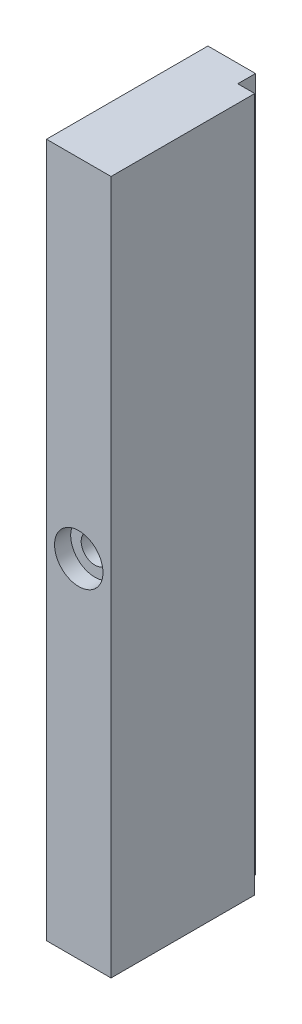
ISO-10303-21;
HEADER;
FILE_DESCRIPTION(('STEP AP214'),'2;1');
FILE_NAME('part.step','',(''),(''),'','','');
FILE_SCHEMA(('AUTOMOTIVE_DESIGN { 1 0 10303 214 1 1 1 1 }'));
ENDSEC;
DATA;
#1=APPLICATION_CONTEXT('core data for automotive mechanical design processes');
#2=APPLICATION_PROTOCOL_DEFINITION('international standard','automotive_design',2000,#1);
#3=PRODUCT_CONTEXT('',#1,'mechanical');
#4=PRODUCT('Part','Part','',(#3));
#5=PRODUCT_RELATED_PRODUCT_CATEGORY('part','',(#4));
#6=PRODUCT_DEFINITION_FORMATION('','',#4);
#7=PRODUCT_DEFINITION_CONTEXT('part definition',#1,'design');
#8=PRODUCT_DEFINITION('design','',#6,#7);
#9=PRODUCT_DEFINITION_SHAPE('','',#8);
#10=(LENGTH_UNIT() NAMED_UNIT(*) SI_UNIT(.MILLI.,.METRE.));
#11=(NAMED_UNIT(*) PLANE_ANGLE_UNIT() SI_UNIT($,.RADIAN.));
#12=(NAMED_UNIT(*) SI_UNIT($,.STERADIAN.) SOLID_ANGLE_UNIT());
#13=UNCERTAINTY_MEASURE_WITH_UNIT(LENGTH_MEASURE(1.E-05),#10,'distance_accuracy_value','');
#14=(GEOMETRIC_REPRESENTATION_CONTEXT(3) GLOBAL_UNCERTAINTY_ASSIGNED_CONTEXT((#13)) GLOBAL_UNIT_ASSIGNED_CONTEXT((#10,
#11,#12)) REPRESENTATION_CONTEXT('',''));
#15=CARTESIAN_POINT('',(0.,0.,0.));
#16=DIRECTION('',(0.,0.,1.));
#17=DIRECTION('',(1.,0.,0.));
#18=AXIS2_PLACEMENT_3D('',#15,#16,#17);
#19=CARTESIAN_POINT('',(132.5,43.,138.));
#20=DIRECTION('',(-1.,0.,0.));
#21=DIRECTION('',(0.,0.,1.));
#22=AXIS2_PLACEMENT_3D('',#19,#20,#21);
#23=PLANE('',#22);
#24=DIRECTION('',(0.,-1.,0.));
#25=VECTOR('',#24,1.);
#26=CARTESIAN_POINT('',(132.5,43.,140.));
#27=LINE('',#26,#25);
#28=CARTESIAN_POINT('',(132.5,43.,140.));
#29=VERTEX_POINT('',#28);
#30=CARTESIAN_POINT('',(132.5,-43.,140.));
#31=VERTEX_POINT('',#30);
#32=EDGE_CURVE('E140',#29,#31,#27,.T.);
#33=ORIENTED_EDGE('',*,*,#32,.F.);
#34=DIRECTION('',(0.,0.,1.));
#35=VECTOR('',#34,1.);
#36=CARTESIAN_POINT('',(132.5,43.,138.));
#37=LINE('',#36,#35);
#38=CARTESIAN_POINT('',(132.5,43.,120.));
#39=VERTEX_POINT('',#38);
#40=EDGE_CURVE('E11',#39,#29,#37,.T.);
#41=ORIENTED_EDGE('',*,*,#40,.F.);
#42=DIRECTION('',(0.,-1.,0.));
#43=VECTOR('',#42,1.);
#44=CARTESIAN_POINT('',(132.5,43.,120.));
#45=LINE('',#44,#43);
#46=CARTESIAN_POINT('',(132.5,-43.,120.));
#47=VERTEX_POINT('',#46);
#48=EDGE_CURVE('E109',#39,#47,#45,.T.);
#49=ORIENTED_EDGE('',*,*,#48,.T.);
#50=DIRECTION('',(0.,0.,1.));
#51=VECTOR('',#50,1.);
#52=CARTESIAN_POINT('',(132.5,-43.,138.));
#53=LINE('',#52,#51);
#54=EDGE_CURVE('E42',#47,#31,#53,.T.);
#55=ORIENTED_EDGE('',*,*,#54,.T.);
#56=EDGE_LOOP('',(#33,#41,#49,#55));
#57=FACE_BOUND('',#56,.T.);
#58=ADVANCED_FACE('F41',(#57),#23,.T.);
#59=CARTESIAN_POINT('',(132.5,43.,138.));
#60=DIRECTION('',(0.,1.,0.));
#61=DIRECTION('',(0.,0.,1.));
#62=AXIS2_PLACEMENT_3D('',#59,#60,#61);
#63=PLANE('',#62);
#64=DIRECTION('',(-1.,0.,0.));
#65=VECTOR('',#64,1.);
#66=CARTESIAN_POINT('',(132.5,43.,140.));
#67=LINE('',#66,#65);
#68=CARTESIAN_POINT('',(140.5,43.,140.));
#69=VERTEX_POINT('',#68);
#70=EDGE_CURVE('E102',#69,#29,#67,.T.);
#71=ORIENTED_EDGE('',*,*,#70,.F.);
#72=DIRECTION('',(0.,0.,1.));
#73=VECTOR('',#72,1.);
#74=CARTESIAN_POINT('',(140.5,43.,138.));
#75=LINE('',#74,#73);
#76=CARTESIAN_POINT('',(140.5,43.,122.2));
#77=VERTEX_POINT('',#76);
#78=EDGE_CURVE('E47',#77,#69,#75,.T.);
#79=ORIENTED_EDGE('',*,*,#78,.F.);
#80=DIRECTION('',(-1.,0.,0.));
#81=VECTOR('',#80,1.);
#82=CARTESIAN_POINT('',(132.5,43.,122.2));
#83=LINE('',#82,#81);
#84=CARTESIAN_POINT('',(138.4,43.,122.2));
#85=VERTEX_POINT('',#84);
#86=EDGE_CURVE('E132',#77,#85,#83,.T.);
#87=ORIENTED_EDGE('',*,*,#86,.T.);
#88=DIRECTION('',(0.,0.,1.));
#89=VECTOR('',#88,1.);
#90=CARTESIAN_POINT('',(138.4,43.,120.));
#91=LINE('',#90,#89);
#92=CARTESIAN_POINT('',(138.4,43.,120.));
#93=VERTEX_POINT('',#92);
#94=EDGE_CURVE('E60',#93,#85,#91,.T.);
#95=ORIENTED_EDGE('',*,*,#94,.F.);
#96=DIRECTION('',(-1.,0.,0.));
#97=VECTOR('',#96,1.);
#98=CARTESIAN_POINT('',(132.5,43.,120.));
#99=LINE('',#98,#97);
#100=EDGE_CURVE('E119',#93,#39,#99,.T.);
#101=ORIENTED_EDGE('',*,*,#100,.T.);
#102=ORIENTED_EDGE('',*,*,#40,.T.);
#103=EDGE_LOOP('',(#71,#79,#87,#95,#101,#102));
#104=FACE_BOUND('',#103,.T.);
#105=ADVANCED_FACE('F158',(#104),#63,.T.);
#106=CARTESIAN_POINT('',(140.5,43.,138.));
#107=DIRECTION('',(1.,0.,0.));
#108=DIRECTION('',(0.,0.,-1.));
#109=AXIS2_PLACEMENT_3D('',#106,#107,#108);
#110=PLANE('',#109);
#111=DIRECTION('',(0.,1.,0.));
#112=VECTOR('',#111,1.);
#113=CARTESIAN_POINT('',(140.5,43.,140.));
#114=LINE('',#113,#112);
#115=CARTESIAN_POINT('',(140.5,-43.,140.));
#116=VERTEX_POINT('',#115);
#117=EDGE_CURVE('E144',#116,#69,#114,.T.);
#118=ORIENTED_EDGE('',*,*,#117,.F.);
#119=DIRECTION('',(0.,0.,1.));
#120=VECTOR('',#119,1.);
#121=CARTESIAN_POINT('',(140.5,-43.,138.));
#122=LINE('',#121,#120);
#123=CARTESIAN_POINT('',(140.5,-43.,122.2));
#124=VERTEX_POINT('',#123);
#125=EDGE_CURVE('E103',#124,#116,#122,.T.);
#126=ORIENTED_EDGE('',*,*,#125,.F.);
#127=DIRECTION('',(0.,1.,0.));
#128=VECTOR('',#127,1.);
#129=CARTESIAN_POINT('',(140.5,43.,122.2));
#130=LINE('',#129,#128);
#131=EDGE_CURVE('E128',#124,#77,#130,.T.);
#132=ORIENTED_EDGE('',*,*,#131,.T.);
#133=ORIENTED_EDGE('',*,*,#78,.T.);
#134=EDGE_LOOP('',(#118,#126,#132,#133));
#135=FACE_BOUND('',#134,.T.);
#136=ADVANCED_FACE('F154',(#135),#110,.T.);
#137=CARTESIAN_POINT('',(132.5,-43.,138.));
#138=DIRECTION('',(0.,-1.,0.));
#139=DIRECTION('',(0.,0.,-1.));
#140=AXIS2_PLACEMENT_3D('',#137,#138,#139);
#141=PLANE('',#140);
#142=DIRECTION('',(1.,0.,0.));
#143=VECTOR('',#142,1.);
#144=CARTESIAN_POINT('',(132.5,-43.,140.));
#145=LINE('',#144,#143);
#146=EDGE_CURVE('E97',#31,#116,#145,.T.);
#147=ORIENTED_EDGE('',*,*,#146,.F.);
#148=ORIENTED_EDGE('',*,*,#54,.F.);
#149=DIRECTION('',(1.,0.,0.));
#150=VECTOR('',#149,1.);
#151=CARTESIAN_POINT('',(132.5,-43.,120.));
#152=LINE('',#151,#150);
#153=CARTESIAN_POINT('',(138.4,-43.,120.));
#154=VERTEX_POINT('',#153);
#155=EDGE_CURVE('E100',#47,#154,#152,.T.);
#156=ORIENTED_EDGE('',*,*,#155,.T.);
#157=DIRECTION('',(0.,0.,1.));
#158=VECTOR('',#157,1.);
#159=CARTESIAN_POINT('',(138.4,-43.,120.));
#160=LINE('',#159,#158);
#161=CARTESIAN_POINT('',(138.4,-43.,122.2));
#162=VERTEX_POINT('',#161);
#163=EDGE_CURVE('E121',#154,#162,#160,.T.);
#164=ORIENTED_EDGE('',*,*,#163,.T.);
#165=DIRECTION('',(1.,0.,0.));
#166=VECTOR('',#165,1.);
#167=CARTESIAN_POINT('',(132.5,-43.,122.2));
#168=LINE('',#167,#166);
#169=EDGE_CURVE('E126',#162,#124,#168,.T.);
#170=ORIENTED_EDGE('',*,*,#169,.T.);
#171=ORIENTED_EDGE('',*,*,#125,.T.);
#172=EDGE_LOOP('',(#147,#148,#156,#164,#170,#171));
#173=FACE_BOUND('',#172,.T.);
#174=ADVANCED_FACE('F96',(#173),#141,.T.);
#175=CARTESIAN_POINT('',(0.,0.,140.));
#176=DIRECTION('',(0.,0.,1.));
#177=DIRECTION('',(1.,0.,0.));
#178=AXIS2_PLACEMENT_3D('',#175,#176,#177);
#179=PLANE('',#178);
#180=CARTESIAN_POINT('',(136.5,0.,140.));
#181=DIRECTION('',(0.,0.,1.));
#182=DIRECTION('',(1.,0.,0.));
#183=AXIS2_PLACEMENT_3D('',#180,#181,#182);
#184=CIRCLE('',#183,3.);
#185=CARTESIAN_POINT('',(139.5,0.,140.));
#186=VERTEX_POINT('',#185);
#187=EDGE_CURVE('E136',#186,#186,#184,.T.);
#188=ORIENTED_EDGE('',*,*,#187,.F.);
#189=EDGE_LOOP('',(#188));
#190=FACE_BOUND('',#189,.T.);
#191=ORIENTED_EDGE('',*,*,#32,.T.);
#192=ORIENTED_EDGE('',*,*,#146,.T.);
#193=ORIENTED_EDGE('',*,*,#117,.T.);
#194=ORIENTED_EDGE('',*,*,#70,.T.);
#195=EDGE_LOOP('',(#191,#192,#193,#194));
#196=FACE_BOUND('',#195,.T.);
#197=ADVANCED_FACE('F160',(#190,#196),#179,.T.);
#198=CARTESIAN_POINT('',(136.5,0.,138.));
#199=DIRECTION('',(0.,0.,1.));
#200=DIRECTION('',(1.,0.,0.));
#201=AXIS2_PLACEMENT_3D('',#198,#199,#200);
#202=CYLINDRICAL_SURFACE('',#201,3.);
#203=CARTESIAN_POINT('',(136.5,0.,138.));
#204=DIRECTION('',(0.,0.,1.));
#205=DIRECTION('',(1.,0.,0.));
#206=AXIS2_PLACEMENT_3D('',#203,#204,#205);
#207=CIRCLE('',#206,3.);
#208=CARTESIAN_POINT('',(139.5,0.,138.));
#209=VERTEX_POINT('',#208);
#210=EDGE_CURVE('E137',#209,#209,#207,.T.);
#211=ORIENTED_EDGE('',*,*,#210,.F.);
#212=EDGE_LOOP('',(#211));
#213=FACE_BOUND('',#212,.T.);
#214=ORIENTED_EDGE('',*,*,#187,.T.);
#215=EDGE_LOOP('',(#214));
#216=FACE_BOUND('',#215,.T.);
#217=ADVANCED_FACE('F191',(#213,#216),#202,.F.);
#218=CARTESIAN_POINT('',(0.,0.,138.));
#219=DIRECTION('',(0.,0.,1.));
#220=DIRECTION('',(1.,0.,0.));
#221=AXIS2_PLACEMENT_3D('',#218,#219,#220);
#222=PLANE('',#221);
#223=CARTESIAN_POINT('',(136.5,0.,138.));
#224=DIRECTION('',(0.,0.,1.));
#225=DIRECTION('',(1.,0.,0.));
#226=AXIS2_PLACEMENT_3D('',#223,#224,#225);
#227=CIRCLE('',#226,1.70000000000001);
#228=CARTESIAN_POINT('',(138.2,0.,138.));
#229=VERTEX_POINT('',#228);
#230=EDGE_CURVE('E123',#229,#229,#227,.T.);
#231=ORIENTED_EDGE('',*,*,#230,.F.);
#232=EDGE_LOOP('',(#231));
#233=FACE_BOUND('',#232,.T.);
#234=ORIENTED_EDGE('',*,*,#210,.T.);
#235=EDGE_LOOP('',(#234));
#236=FACE_BOUND('',#235,.T.);
#237=ADVANCED_FACE('F198',(#233,#236),#222,.T.);
#238=CARTESIAN_POINT('',(0.,0.,122.2));
#239=DIRECTION('',(0.,0.,1.));
#240=DIRECTION('',(1.,0.,0.));
#241=AXIS2_PLACEMENT_3D('',#238,#239,#240);
#242=PLANE('',#241);
#243=ORIENTED_EDGE('',*,*,#169,.F.);
#244=DIRECTION('',(0.,1.,0.));
#245=VECTOR('',#244,1.);
#246=CARTESIAN_POINT('',(138.4,43.,122.2));
#247=LINE('',#246,#245);
#248=EDGE_CURVE('E114',#162,#85,#247,.T.);
#249=ORIENTED_EDGE('',*,*,#248,.T.);
#250=ORIENTED_EDGE('',*,*,#86,.F.);
#251=ORIENTED_EDGE('',*,*,#131,.F.);
#252=EDGE_LOOP('',(#243,#249,#250,#251));
#253=FACE_BOUND('',#252,.T.);
#254=ADVANCED_FACE('F161',(#253),#242,.F.);
#255=CARTESIAN_POINT('',(136.5,0.,122.2));
#256=DIRECTION('',(0.,0.,1.));
#257=DIRECTION('',(1.,0.,0.));
#258=AXIS2_PLACEMENT_3D('',#255,#256,#257);
#259=CYLINDRICAL_SURFACE('',#258,1.70000000000001);
#260=ORIENTED_EDGE('',*,*,#230,.T.);
#261=EDGE_LOOP('',(#260));
#262=FACE_BOUND('',#261,.T.);
#263=CARTESIAN_POINT('',(136.5,0.,120.));
#264=DIRECTION('',(0.,0.,1.));
#265=DIRECTION('',(1.,0.,0.));
#266=AXIS2_PLACEMENT_3D('',#263,#264,#265);
#267=CIRCLE('',#266,1.70000000000001);
#268=CARTESIAN_POINT('',(138.2,0.,120.));
#269=VERTEX_POINT('',#268);
#270=EDGE_CURVE('E113',#269,#269,#267,.T.);
#271=ORIENTED_EDGE('',*,*,#270,.F.);
#272=EDGE_LOOP('',(#271));
#273=FACE_BOUND('',#272,.T.);
#274=ADVANCED_FACE('F163',(#262,#273),#259,.F.);
#275=CARTESIAN_POINT('',(138.4,43.,120.));
#276=DIRECTION('',(1.,0.,0.));
#277=DIRECTION('',(0.,0.,-1.));
#278=AXIS2_PLACEMENT_3D('',#275,#276,#277);
#279=PLANE('',#278);
#280=ORIENTED_EDGE('',*,*,#248,.F.);
#281=ORIENTED_EDGE('',*,*,#163,.F.);
#282=DIRECTION('',(0.,1.,0.));
#283=VECTOR('',#282,1.);
#284=CARTESIAN_POINT('',(138.4,43.,120.));
#285=LINE('',#284,#283);
#286=EDGE_CURVE('E112',#154,#93,#285,.T.);
#287=ORIENTED_EDGE('',*,*,#286,.T.);
#288=ORIENTED_EDGE('',*,*,#94,.T.);
#289=EDGE_LOOP('',(#280,#281,#287,#288));
#290=FACE_BOUND('',#289,.T.);
#291=ADVANCED_FACE('F165',(#290),#279,.T.);
#292=CARTESIAN_POINT('',(0.,0.,120.));
#293=DIRECTION('',(0.,0.,1.));
#294=DIRECTION('',(1.,0.,0.));
#295=AXIS2_PLACEMENT_3D('',#292,#293,#294);
#296=PLANE('',#295);
#297=ORIENTED_EDGE('',*,*,#270,.T.);
#298=EDGE_LOOP('',(#297));
#299=FACE_BOUND('',#298,.T.);
#300=ORIENTED_EDGE('',*,*,#48,.F.);
#301=ORIENTED_EDGE('',*,*,#100,.F.);
#302=ORIENTED_EDGE('',*,*,#286,.F.);
#303=ORIENTED_EDGE('',*,*,#155,.F.);
#304=EDGE_LOOP('',(#300,#301,#302,#303));
#305=FACE_BOUND('',#304,.T.);
#306=ADVANCED_FACE('F107',(#299,#305),#296,.F.);
#307=CLOSED_SHELL('',(#58,#105,#136,#174,#197,#217,#237,#254,#274,#291,#306));
#308=MANIFOLD_SOLID_BREP('B2',#307);
#309=ADVANCED_BREP_SHAPE_REPRESENTATION('',(#18,#308),#14);
#310=SHAPE_DEFINITION_REPRESENTATION(#9,#309);
ENDSEC;
END-ISO-10303-21;
